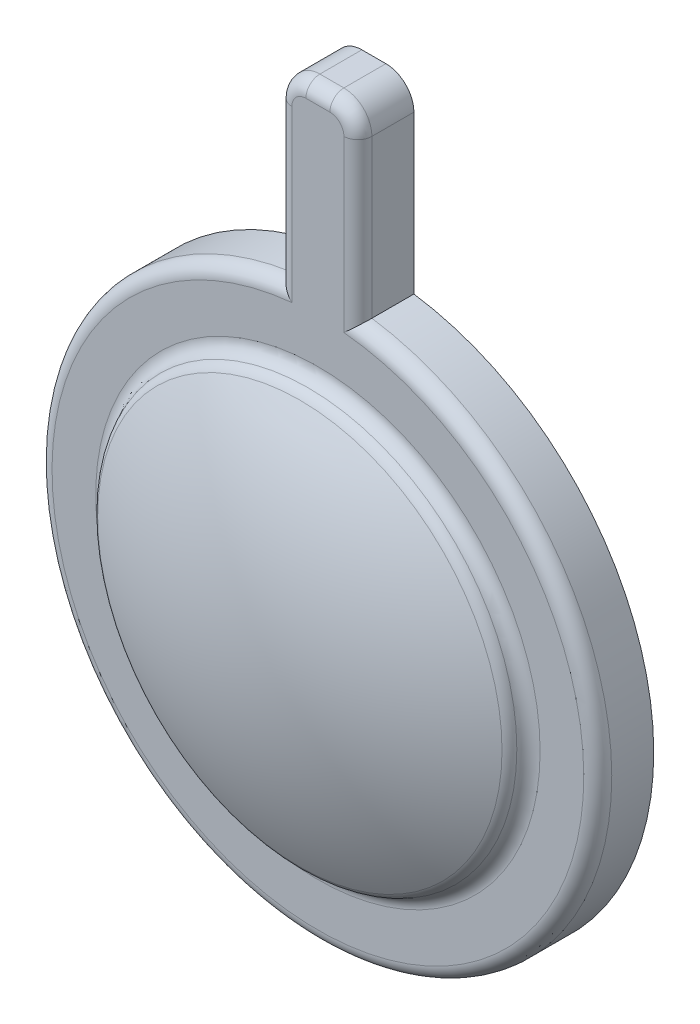
ISO-10303-21;
HEADER;
FILE_DESCRIPTION(('STEP AP214'),'2;1');
FILE_NAME('part.step','',(''),(''),'','','');
FILE_SCHEMA(('AUTOMOTIVE_DESIGN { 1 0 10303 214 1 1 1 1 }'));
ENDSEC;
DATA;
#1=APPLICATION_CONTEXT('core data for automotive mechanical design processes');
#2=APPLICATION_PROTOCOL_DEFINITION('international standard','automotive_design',2000,#1);
#3=PRODUCT_CONTEXT('',#1,'mechanical');
#4=PRODUCT('Part','Part','',(#3));
#5=PRODUCT_RELATED_PRODUCT_CATEGORY('part','',(#4));
#6=PRODUCT_DEFINITION_FORMATION('','',#4);
#7=PRODUCT_DEFINITION_CONTEXT('part definition',#1,'design');
#8=PRODUCT_DEFINITION('design','',#6,#7);
#9=PRODUCT_DEFINITION_SHAPE('','',#8);
#10=(LENGTH_UNIT() NAMED_UNIT(*) SI_UNIT(.MILLI.,.METRE.));
#11=(NAMED_UNIT(*) PLANE_ANGLE_UNIT() SI_UNIT($,.RADIAN.));
#12=(NAMED_UNIT(*) SI_UNIT($,.STERADIAN.) SOLID_ANGLE_UNIT());
#13=UNCERTAINTY_MEASURE_WITH_UNIT(LENGTH_MEASURE(1.E-05),#10,'distance_accuracy_value','');
#14=(GEOMETRIC_REPRESENTATION_CONTEXT(3) GLOBAL_UNCERTAINTY_ASSIGNED_CONTEXT((#13)) GLOBAL_UNIT_ASSIGNED_CONTEXT((#10,
#11,#12)) REPRESENTATION_CONTEXT('',''));
#15=CARTESIAN_POINT('',(0.,0.,0.));
#16=DIRECTION('',(0.,0.,1.));
#17=DIRECTION('',(1.,0.,0.));
#18=AXIS2_PLACEMENT_3D('',#15,#16,#17);
#19=CARTESIAN_POINT('',(0.,0.,4.));
#20=DIRECTION('',(0.,0.,-1.));
#21=DIRECTION('',(-1.,0.,0.));
#22=AXIS2_PLACEMENT_3D('',#19,#20,#21);
#23=CYLINDRICAL_SURFACE('',#22,20.);
#24=DIRECTION('',(0.,0.,-1.));
#25=VECTOR('',#24,1.);
#26=CARTESIAN_POINT('',(2.85828742721664,19.7947011339756,4.));
#27=LINE('',#26,#25);
#28=CARTESIAN_POINT('',(2.85828742721664,19.7947011339756,0.));
#29=VERTEX_POINT('',#28);
#30=CARTESIAN_POINT('',(2.85828742721664,19.7947011339756,3.));
#31=VERTEX_POINT('',#30);
#32=EDGE_CURVE('E136',#29,#31,#27,.F.);
#33=ORIENTED_EDGE('',*,*,#32,.T.);
#34=CARTESIAN_POINT('',(0.,0.,3.));
#35=DIRECTION('',(0.,0.,1.));
#36=DIRECTION('',(1.,0.,0.));
#37=AXIS2_PLACEMENT_3D('',#34,#35,#36);
#38=CIRCLE('',#37,20.);
#39=CARTESIAN_POINT('',(-2.85828742721664,19.7947011339756,3.));
#40=VERTEX_POINT('',#39);
#41=EDGE_CURVE('E42',#31,#40,#38,.F.);
#42=ORIENTED_EDGE('',*,*,#41,.T.);
#43=DIRECTION('',(0.,0.,-1.));
#44=VECTOR('',#43,1.);
#45=CARTESIAN_POINT('',(-2.85828742721664,19.7947011339756,4.));
#46=LINE('',#45,#44);
#47=CARTESIAN_POINT('',(-2.85828742721664,19.7947011339756,0.));
#48=VERTEX_POINT('',#47);
#49=EDGE_CURVE('E141',#40,#48,#46,.T.);
#50=ORIENTED_EDGE('',*,*,#49,.T.);
#51=CARTESIAN_POINT('',(0.,0.,0.));
#52=DIRECTION('',(0.,0.,1.));
#53=DIRECTION('',(1.,0.,0.));
#54=AXIS2_PLACEMENT_3D('',#51,#52,#53);
#55=CIRCLE('',#54,20.);
#56=EDGE_CURVE('E119',#48,#29,#55,.T.);
#57=ORIENTED_EDGE('',*,*,#56,.T.);
#58=EDGE_LOOP('',(#33,#42,#50,#57));
#59=FACE_BOUND('',#58,.T.);
#60=ADVANCED_FACE('F33',(#59),#23,.T.);
#61=CARTESIAN_POINT('',(0.,0.,4.));
#62=DIRECTION('',(0.,0.,1.));
#63=DIRECTION('',(1.,0.,0.));
#64=AXIS2_PLACEMENT_3D('',#61,#62,#63);
#65=PLANE('',#64);
#66=CARTESIAN_POINT('',(0.,0.,4.));
#67=DIRECTION('',(0.,0.,1.));
#68=DIRECTION('',(1.,0.,0.));
#69=AXIS2_PLACEMENT_3D('',#66,#67,#68);
#70=CIRCLE('',#69,19.);
#71=CARTESIAN_POINT('',(-1.85828742721664,18.9089071032106,4.));
#72=VERTEX_POINT('',#71);
#73=CARTESIAN_POINT('',(1.85828742721664,18.9089071032106,4.));
#74=VERTEX_POINT('',#73);
#75=EDGE_CURVE('E164',#72,#74,#70,.T.);
#76=ORIENTED_EDGE('',*,*,#75,.T.);
#77=DIRECTION('',(0.,-1.,0.));
#78=VECTOR('',#77,1.);
#79=CARTESIAN_POINT('',(1.85828742721664,0.,4.));
#80=LINE('',#79,#78);
#81=CARTESIAN_POINT('',(1.85828742721664,31.0503449964803,4.));
#82=VERTEX_POINT('',#81);
#83=EDGE_CURVE('E172',#74,#82,#80,.F.);
#84=ORIENTED_EDGE('',*,*,#83,.T.);
#85=CARTESIAN_POINT('',(0.85828742721664,31.0503449964803,4.));
#86=DIRECTION('',(0.,0.,1.));
#87=DIRECTION('',(1.,0.,0.));
#88=AXIS2_PLACEMENT_3D('',#85,#86,#87);
#89=CIRCLE('',#88,0.999999999999999);
#90=CARTESIAN_POINT('',(0.858287427216633,32.0503449964803,4.));
#91=VERTEX_POINT('',#90);
#92=EDGE_CURVE('E170',#82,#91,#89,.T.);
#93=ORIENTED_EDGE('',*,*,#92,.T.);
#94=DIRECTION('',(1.,0.,0.));
#95=VECTOR('',#94,1.);
#96=CARTESIAN_POINT('',(0.,32.0503449964803,4.));
#97=LINE('',#96,#95);
#98=CARTESIAN_POINT('',(-0.858287427216625,32.0503449964803,4.));
#99=VERTEX_POINT('',#98);
#100=EDGE_CURVE('E168',#91,#99,#97,.F.);
#101=ORIENTED_EDGE('',*,*,#100,.T.);
#102=CARTESIAN_POINT('',(-0.85828742721664,31.0503449964803,4.));
#103=DIRECTION('',(0.,0.,1.));
#104=DIRECTION('',(1.,0.,0.));
#105=AXIS2_PLACEMENT_3D('',#102,#103,#104);
#106=CIRCLE('',#105,0.999999999999999);
#107=CARTESIAN_POINT('',(-1.85828742721664,31.0503449964803,4.));
#108=VERTEX_POINT('',#107);
#109=EDGE_CURVE('E166',#99,#108,#106,.T.);
#110=ORIENTED_EDGE('',*,*,#109,.T.);
#111=DIRECTION('',(0.,1.,0.));
#112=VECTOR('',#111,1.);
#113=CARTESIAN_POINT('',(-1.85828742721664,0.,4.));
#114=LINE('',#113,#112);
#115=EDGE_CURVE('E162',#108,#72,#114,.F.);
#116=ORIENTED_EDGE('',*,*,#115,.T.);
#117=EDGE_LOOP('',(#76,#84,#93,#101,#110,#116));
#118=FACE_BOUND('',#117,.T.);
#119=CARTESIAN_POINT('',(0.,0.,4.));
#120=DIRECTION('',(0.,0.,1.));
#121=DIRECTION('',(1.,0.,0.));
#122=AXIS2_PLACEMENT_3D('',#119,#120,#121);
#123=CIRCLE('',#122,15.8800100936206);
#124=CARTESIAN_POINT('',(15.8800100936206,0.,4.));
#125=VERTEX_POINT('',#124);
#126=EDGE_CURVE('E156',#125,#125,#123,.F.);
#127=ORIENTED_EDGE('',*,*,#126,.T.);
#128=EDGE_LOOP('',(#127));
#129=FACE_BOUND('',#128,.T.);
#130=ADVANCED_FACE('F241',(#118,#129),#65,.T.);
#131=CARTESIAN_POINT('',(0.,0.,0.));
#132=DIRECTION('',(0.,0.,1.));
#133=DIRECTION('',(1.,0.,0.));
#134=AXIS2_PLACEMENT_3D('',#131,#132,#133);
#135=PLANE('',#134);
#136=CARTESIAN_POINT('',(0.,0.,0.));
#137=DIRECTION('',(0.,0.,1.));
#138=DIRECTION('',(1.,0.,0.));
#139=AXIS2_PLACEMENT_3D('',#136,#137,#138);
#140=CIRCLE('',#139,4.2);
#141=CARTESIAN_POINT('',(4.2,0.,0.));
#142=VERTEX_POINT('',#141);
#143=EDGE_CURVE('E147',#142,#142,#140,.F.);
#144=ORIENTED_EDGE('',*,*,#143,.F.);
#145=EDGE_LOOP('',(#144));
#146=FACE_BOUND('',#145,.T.);
#147=CARTESIAN_POINT('',(-7.00080184795615E-12,-15.5040048462578,0.));
#148=DIRECTION('',(0.,0.,1.));
#149=DIRECTION('',(1.,0.,0.));
#150=AXIS2_PLACEMENT_3D('',#147,#148,#149);
#151=CIRCLE('',#150,1.5);
#152=CARTESIAN_POINT('',(1.499999999993,-15.5040048462578,0.));
#153=VERTEX_POINT('',#152);
#154=EDGE_CURVE('E144',#153,#153,#151,.F.);
#155=ORIENTED_EDGE('',*,*,#154,.F.);
#156=EDGE_LOOP('',(#155));
#157=FACE_BOUND('',#156,.T.);
#158=CARTESIAN_POINT('',(-2.61075883134509E-12,28.4108423539282,0.));
#159=DIRECTION('',(0.,0.,-1.));
#160=DIRECTION('',(-1.,0.,0.));
#161=AXIS2_PLACEMENT_3D('',#158,#159,#160);
#162=CIRCLE('',#161,1.5);
#163=CARTESIAN_POINT('',(-1.50000000000261,28.4108423539282,0.));
#164=VERTEX_POINT('',#163);
#165=EDGE_CURVE('E231',#164,#164,#162,.T.);
#166=ORIENTED_EDGE('',*,*,#165,.F.);
#167=EDGE_LOOP('',(#166));
#168=FACE_BOUND('',#167,.T.);
#169=ORIENTED_EDGE('',*,*,#56,.F.);
#170=DIRECTION('',(0.,1.,0.));
#171=VECTOR('',#170,1.);
#172=CARTESIAN_POINT('',(-2.85828742721664,14.4082290696023,0.));
#173=LINE('',#172,#171);
#174=CARTESIAN_POINT('',(-2.85828742721664,31.0503449964803,0.));
#175=VERTEX_POINT('',#174);
#176=EDGE_CURVE('E105',#48,#175,#173,.T.);
#177=ORIENTED_EDGE('',*,*,#176,.T.);
#178=CARTESIAN_POINT('',(-0.85828742721664,31.0503449964803,0.));
#179=DIRECTION('',(0.,0.,-1.));
#180=DIRECTION('',(-1.,0.,0.));
#181=AXIS2_PLACEMENT_3D('',#178,#179,#180);
#182=CIRCLE('',#181,2.);
#183=CARTESIAN_POINT('',(-0.858287427216625,33.0503449964803,0.));
#184=VERTEX_POINT('',#183);
#185=EDGE_CURVE('E117',#175,#184,#182,.T.);
#186=ORIENTED_EDGE('',*,*,#185,.T.);
#187=DIRECTION('',(1.,0.,0.));
#188=VECTOR('',#187,1.);
#189=CARTESIAN_POINT('',(-0.858287427216625,33.0503449964803,0.));
#190=LINE('',#189,#188);
#191=CARTESIAN_POINT('',(0.858287427216625,33.0503449964803,0.));
#192=VERTEX_POINT('',#191);
#193=EDGE_CURVE('E125',#184,#192,#190,.T.);
#194=ORIENTED_EDGE('',*,*,#193,.T.);
#195=CARTESIAN_POINT('',(0.85828742721664,31.0503449964803,0.));
#196=DIRECTION('',(0.,0.,-1.));
#197=DIRECTION('',(-1.,0.,0.));
#198=AXIS2_PLACEMENT_3D('',#195,#196,#197);
#199=CIRCLE('',#198,2.);
#200=CARTESIAN_POINT('',(2.85828742721664,31.0503449964803,0.));
#201=VERTEX_POINT('',#200);
#202=EDGE_CURVE('E127',#192,#201,#199,.T.);
#203=ORIENTED_EDGE('',*,*,#202,.T.);
#204=DIRECTION('',(0.,-1.,0.));
#205=VECTOR('',#204,1.);
#206=CARTESIAN_POINT('',(2.85828742721664,14.4082290696023,0.));
#207=LINE('',#206,#205);
#208=EDGE_CURVE('E110',#201,#29,#207,.T.);
#209=ORIENTED_EDGE('',*,*,#208,.T.);
#210=EDGE_LOOP('',(#169,#177,#186,#194,#203,#209));
#211=FACE_BOUND('',#210,.T.);
#212=ADVANCED_FACE('F115',(#146,#157,#168,#211),#135,.F.);
#213=CARTESIAN_POINT('',(-2.85828742721664,14.4082290696023,4.));
#214=DIRECTION('',(-1.,0.,0.));
#215=DIRECTION('',(0.,0.,1.));
#216=AXIS2_PLACEMENT_3D('',#213,#214,#215);
#217=PLANE('',#216);
#218=ORIENTED_EDGE('',*,*,#49,.F.);
#219=DIRECTION('',(0.,1.,0.));
#220=VECTOR('',#219,1.);
#221=CARTESIAN_POINT('',(-2.85828742721664,14.4082290696023,3.));
#222=LINE('',#221,#220);
#223=CARTESIAN_POINT('',(-2.85828742721664,31.0503449964803,3.));
#224=VERTEX_POINT('',#223);
#225=EDGE_CURVE('E11',#40,#224,#222,.T.);
#226=ORIENTED_EDGE('',*,*,#225,.T.);
#227=DIRECTION('',(0.,0.,-1.));
#228=VECTOR('',#227,1.);
#229=CARTESIAN_POINT('',(-2.85828742721664,31.0503449964803,4.));
#230=LINE('',#229,#228);
#231=EDGE_CURVE('E102',#224,#175,#230,.T.);
#232=ORIENTED_EDGE('',*,*,#231,.T.);
#233=ORIENTED_EDGE('',*,*,#176,.F.);
#234=EDGE_LOOP('',(#218,#226,#232,#233));
#235=FACE_BOUND('',#234,.T.);
#236=ADVANCED_FACE('F104',(#235),#217,.T.);
#237=CARTESIAN_POINT('',(2.85828742721664,14.4082290696023,4.));
#238=DIRECTION('',(1.,0.,0.));
#239=DIRECTION('',(0.,0.,-1.));
#240=AXIS2_PLACEMENT_3D('',#237,#238,#239);
#241=PLANE('',#240);
#242=DIRECTION('',(0.,0.,-1.));
#243=VECTOR('',#242,1.);
#244=CARTESIAN_POINT('',(2.85828742721664,31.0503449964803,4.));
#245=LINE('',#244,#243);
#246=CARTESIAN_POINT('',(2.85828742721664,31.0503449964803,3.));
#247=VERTEX_POINT('',#246);
#248=EDGE_CURVE('E134',#247,#201,#245,.T.);
#249=ORIENTED_EDGE('',*,*,#248,.F.);
#250=DIRECTION('',(0.,-1.,0.));
#251=VECTOR('',#250,1.);
#252=CARTESIAN_POINT('',(2.85828742721664,14.4082290696023,3.));
#253=LINE('',#252,#251);
#254=EDGE_CURVE('E159',#247,#31,#253,.T.);
#255=ORIENTED_EDGE('',*,*,#254,.T.);
#256=ORIENTED_EDGE('',*,*,#32,.F.);
#257=ORIENTED_EDGE('',*,*,#208,.F.);
#258=EDGE_LOOP('',(#249,#255,#256,#257));
#259=FACE_BOUND('',#258,.T.);
#260=ADVANCED_FACE('F248',(#259),#241,.T.);
#261=CARTESIAN_POINT('',(0.85828742721664,31.0503449964803,4.));
#262=DIRECTION('',(0.,0.,-1.));
#263=DIRECTION('',(-1.,0.,0.));
#264=AXIS2_PLACEMENT_3D('',#261,#262,#263);
#265=CYLINDRICAL_SURFACE('',#264,2.);
#266=DIRECTION('',(0.,0.,-1.));
#267=VECTOR('',#266,1.);
#268=CARTESIAN_POINT('',(0.858287427216625,33.0503449964803,4.));
#269=LINE('',#268,#267);
#270=CARTESIAN_POINT('',(0.858287427216625,33.0503449964803,3.));
#271=VERTEX_POINT('',#270);
#272=EDGE_CURVE('E137',#271,#192,#269,.T.);
#273=ORIENTED_EDGE('',*,*,#272,.F.);
#274=CARTESIAN_POINT('',(0.85828742721664,31.0503449964803,3.));
#275=DIRECTION('',(0.,0.,1.));
#276=DIRECTION('',(1.,0.,0.));
#277=AXIS2_PLACEMENT_3D('',#274,#275,#276);
#278=CIRCLE('',#277,2.);
#279=EDGE_CURVE('E175',#271,#247,#278,.F.);
#280=ORIENTED_EDGE('',*,*,#279,.T.);
#281=ORIENTED_EDGE('',*,*,#248,.T.);
#282=ORIENTED_EDGE('',*,*,#202,.F.);
#283=EDGE_LOOP('',(#273,#280,#281,#282));
#284=FACE_BOUND('',#283,.T.);
#285=ADVANCED_FACE('F297',(#284),#265,.T.);
#286=CARTESIAN_POINT('',(-0.858287427216625,33.0503449964803,4.));
#287=DIRECTION('',(0.,1.,0.));
#288=DIRECTION('',(0.,0.,1.));
#289=AXIS2_PLACEMENT_3D('',#286,#287,#288);
#290=PLANE('',#289);
#291=DIRECTION('',(0.,0.,-1.));
#292=VECTOR('',#291,1.);
#293=CARTESIAN_POINT('',(-0.858287427216625,33.0503449964803,4.));
#294=LINE('',#293,#292);
#295=CARTESIAN_POINT('',(-0.858287427216625,33.0503449964803,3.));
#296=VERTEX_POINT('',#295);
#297=EDGE_CURVE('E109',#296,#184,#294,.T.);
#298=ORIENTED_EDGE('',*,*,#297,.F.);
#299=DIRECTION('',(1.,0.,0.));
#300=VECTOR('',#299,1.);
#301=CARTESIAN_POINT('',(-0.858287427216625,33.0503449964803,3.));
#302=LINE('',#301,#300);
#303=EDGE_CURVE('E177',#296,#271,#302,.T.);
#304=ORIENTED_EDGE('',*,*,#303,.T.);
#305=ORIENTED_EDGE('',*,*,#272,.T.);
#306=ORIENTED_EDGE('',*,*,#193,.F.);
#307=EDGE_LOOP('',(#298,#304,#305,#306));
#308=FACE_BOUND('',#307,.T.);
#309=ADVANCED_FACE('F303',(#308),#290,.T.);
#310=CARTESIAN_POINT('',(-0.85828742721664,31.0503449964803,4.));
#311=DIRECTION('',(0.,0.,-1.));
#312=DIRECTION('',(-1.,0.,0.));
#313=AXIS2_PLACEMENT_3D('',#310,#311,#312);
#314=CYLINDRICAL_SURFACE('',#313,2.);
#315=ORIENTED_EDGE('',*,*,#231,.F.);
#316=CARTESIAN_POINT('',(-0.85828742721664,31.0503449964803,3.));
#317=DIRECTION('',(0.,0.,1.));
#318=DIRECTION('',(1.,0.,0.));
#319=AXIS2_PLACEMENT_3D('',#316,#317,#318);
#320=CIRCLE('',#319,2.);
#321=EDGE_CURVE('E179',#224,#296,#320,.F.);
#322=ORIENTED_EDGE('',*,*,#321,.T.);
#323=ORIENTED_EDGE('',*,*,#297,.T.);
#324=ORIENTED_EDGE('',*,*,#185,.F.);
#325=EDGE_LOOP('',(#315,#322,#323,#324));
#326=FACE_BOUND('',#325,.T.);
#327=ADVANCED_FACE('F122',(#326),#314,.T.);
#328=CARTESIAN_POINT('',(-2.61075883134509E-12,28.4108423539282,2.1));
#329=DIRECTION('',(0.,0.,-1.));
#330=DIRECTION('',(-1.,0.,0.));
#331=AXIS2_PLACEMENT_3D('',#328,#329,#330);
#332=CYLINDRICAL_SURFACE('',#331,1.5);
#333=CARTESIAN_POINT('',(-2.61075883134509E-12,28.4108423539282,2.1));
#334=DIRECTION('',(0.,0.,-1.));
#335=DIRECTION('',(-1.,0.,0.));
#336=AXIS2_PLACEMENT_3D('',#333,#334,#335);
#337=CIRCLE('',#336,1.5);
#338=CARTESIAN_POINT('',(-1.50000000000261,28.4108423539282,2.1));
#339=VERTEX_POINT('',#338);
#340=EDGE_CURVE('E120',#339,#339,#337,.T.);
#341=ORIENTED_EDGE('',*,*,#340,.F.);
#342=EDGE_LOOP('',(#341));
#343=FACE_BOUND('',#342,.T.);
#344=ORIENTED_EDGE('',*,*,#165,.T.);
#345=EDGE_LOOP('',(#344));
#346=FACE_BOUND('',#345,.T.);
#347=ADVANCED_FACE('F238',(#343,#346),#332,.F.);
#348=CARTESIAN_POINT('',(-2.61075883134509E-12,28.4108423539282,2.1));
#349=DIRECTION('',(0.,0.,-1.));
#350=DIRECTION('',(-1.,0.,0.));
#351=AXIS2_PLACEMENT_3D('',#348,#349,#350);
#352=PLANE('',#351);
#353=ORIENTED_EDGE('',*,*,#340,.T.);
#354=EDGE_LOOP('',(#353));
#355=FACE_BOUND('',#354,.T.);
#356=ADVANCED_FACE('F332',(#355),#352,.T.);
#357=CARTESIAN_POINT('',(-7.00080184795615E-12,-15.5040048462578,-1.));
#358=DIRECTION('',(0.,0.,1.));
#359=DIRECTION('',(1.,0.,0.));
#360=AXIS2_PLACEMENT_3D('',#357,#358,#359);
#361=CYLINDRICAL_SURFACE('',#360,1.5);
#362=CARTESIAN_POINT('',(-7.00080184795615E-12,-15.5040048462578,-1.));
#363=DIRECTION('',(0.,0.,-1.));
#364=DIRECTION('',(-1.,0.,0.));
#365=AXIS2_PLACEMENT_3D('',#362,#363,#364);
#366=CIRCLE('',#365,1.5);
#367=CARTESIAN_POINT('',(-1.500000000007,-15.5040048462578,-1.));
#368=VERTEX_POINT('',#367);
#369=EDGE_CURVE('E226',#368,#368,#366,.T.);
#370=ORIENTED_EDGE('',*,*,#369,.F.);
#371=EDGE_LOOP('',(#370));
#372=FACE_BOUND('',#371,.T.);
#373=ORIENTED_EDGE('',*,*,#154,.T.);
#374=EDGE_LOOP('',(#373));
#375=FACE_BOUND('',#374,.T.);
#376=ADVANCED_FACE('F325',(#372,#375),#361,.T.);
#377=CARTESIAN_POINT('',(-7.00080184795615E-12,-15.5040048462578,-1.));
#378=DIRECTION('',(0.,0.,-1.));
#379=DIRECTION('',(-1.,0.,0.));
#380=AXIS2_PLACEMENT_3D('',#377,#378,#379);
#381=PLANE('',#380);
#382=ORIENTED_EDGE('',*,*,#369,.T.);
#383=EDGE_LOOP('',(#382));
#384=FACE_BOUND('',#383,.T.);
#385=ADVANCED_FACE('F320',(#384),#381,.T.);
#386=CARTESIAN_POINT('',(0.,0.,-18.7223939239338));
#387=DIRECTION('',(0.,0.,1.));
#388=DIRECTION('',(1.,0.,0.));
#389=AXIS2_PLACEMENT_3D('',#386,#387,#388);
#390=CYLINDRICAL_SURFACE('',#389,4.2);
#391=CARTESIAN_POINT('',(0.,0.,-6.84299999999984));
#392=DIRECTION('',(0.,0.,1.));
#393=DIRECTION('',(1.,0.,0.));
#394=AXIS2_PLACEMENT_3D('',#391,#392,#393);
#395=CIRCLE('',#394,4.2);
#396=CARTESIAN_POINT('',(4.2,0.,-6.84299999999991));
#397=VERTEX_POINT('',#396);
#398=EDGE_CURVE('E220',#397,#397,#395,.T.);
#399=ORIENTED_EDGE('',*,*,#398,.T.);
#400=EDGE_LOOP('',(#399));
#401=FACE_BOUND('',#400,.T.);
#402=ORIENTED_EDGE('',*,*,#143,.T.);
#403=EDGE_LOOP('',(#402));
#404=FACE_BOUND('',#403,.T.);
#405=ADVANCED_FACE('F315',(#401,#404),#390,.T.);
#406=CARTESIAN_POINT('',(-9.59999999999755,1.1790189731845E-13,-6.84299999999967));
#407=DIRECTION('',(0.,0.,1.));
#408=DIRECTION('',(0.,1.,0.));
#409=AXIS2_PLACEMENT_3D('',#406,#407,#408);
#410=PLANE('',#409);
#411=ORIENTED_EDGE('',*,*,#398,.F.);
#412=EDGE_LOOP('',(#411));
#413=FACE_BOUND('',#412,.T.);
#414=ADVANCED_FACE('F263',(#413),#410,.F.);
#415=CARTESIAN_POINT('',(0.,0.,-21.0029498723444));
#416=DIRECTION('',(0.,0.,1.));
#417=DIRECTION('',(1.,0.,0.));
#418=AXIS2_PLACEMENT_3D('',#415,#416,#417);
#419=SPHERICAL_SURFACE('',#418,30.0029498723444);
#420=CARTESIAN_POINT('',(0.,0.,5.29159868214314));
#421=DIRECTION('',(0.,0.,-1.));
#422=DIRECTION('',(-1.,0.,0.));
#423=AXIS2_PLACEMENT_3D('',#420,#421,#422);
#424=CIRCLE('',#423,14.4490040265102);
#425=CARTESIAN_POINT('',(-14.4490040265102,0.,5.29159868214314));
#426=VERTEX_POINT('',#425);
#427=EDGE_CURVE('E150',#426,#426,#424,.F.);
#428=ORIENTED_EDGE('',*,*,#427,.T.);
#429=EDGE_LOOP('',(#428));
#430=FACE_BOUND('',#429,.T.);
#431=ADVANCED_FACE('F259',(#430),#419,.T.);
#432=CARTESIAN_POINT('',(0.,0.,4.41519990581065));
#433=DIRECTION('',(0.,0.,-1.));
#434=DIRECTION('',(-1.,0.,0.));
#435=AXIS2_PLACEMENT_3D('',#432,#433,#434);
#436=TOROIDAL_SURFACE('',#435,13.9674179128785,1.);
#437=CARTESIAN_POINT('',(0.,0.,4.70759995290533));
#438=DIRECTION('',(0.,0.,-1.));
#439=DIRECTION('',(-1.,0.,0.));
#440=AXIS2_PLACEMENT_3D('',#437,#438,#439);
#441=CIRCLE('',#440,14.9237140032496);
#442=CARTESIAN_POINT('',(-14.9237140032496,0.,4.70759995290533));
#443=VERTEX_POINT('',#442);
#444=EDGE_CURVE('E153',#443,#443,#441,.F.);
#445=ORIENTED_EDGE('',*,*,#444,.T.);
#446=EDGE_LOOP('',(#445));
#447=FACE_BOUND('',#446,.T.);
#448=ORIENTED_EDGE('',*,*,#427,.F.);
#449=EDGE_LOOP('',(#448));
#450=FACE_BOUND('',#449,.T.);
#451=ADVANCED_FACE('F262',(#447,#450),#436,.T.);
#452=CARTESIAN_POINT('',(0.,0.,5.));
#453=DIRECTION('',(0.,0.,1.));
#454=DIRECTION('',(1.,0.,0.));
#455=AXIS2_PLACEMENT_3D('',#452,#453,#454);
#456=TOROIDAL_SURFACE('',#455,15.8800100936206,1.);
#457=ORIENTED_EDGE('',*,*,#126,.F.);
#458=EDGE_LOOP('',(#457));
#459=FACE_BOUND('',#458,.T.);
#460=ORIENTED_EDGE('',*,*,#444,.F.);
#461=EDGE_LOOP('',(#460));
#462=FACE_BOUND('',#461,.T.);
#463=ADVANCED_FACE('F266',(#459,#462),#456,.F.);
#464=CARTESIAN_POINT('',(-0.85828742721664,31.0503449964803,3.));
#465=DIRECTION('',(0.,0.,1.));
#466=DIRECTION('',(1.,0.,0.));
#467=AXIS2_PLACEMENT_3D('',#464,#465,#466);
#468=DEGENERATE_TOROIDAL_SURFACE('',#467,0.999999999999999,1.,.T.);
#469=CARTESIAN_POINT('',(-1.85828742721664,31.0503449964803,3.));
#470=DIRECTION('',(0.,-1.,0.));
#471=DIRECTION('',(1.,0.,0.));
#472=AXIS2_PLACEMENT_3D('',#469,#470,#471);
#473=CIRCLE('',#472,1.);
#474=EDGE_CURVE('E214',#108,#224,#473,.T.);
#475=ORIENTED_EDGE('',*,*,#474,.F.);
#476=ORIENTED_EDGE('',*,*,#109,.F.);
#477=CARTESIAN_POINT('',(-0.858287427216633,32.0503449964803,3.));
#478=DIRECTION('',(1.,0.,0.));
#479=DIRECTION('',(0.,0.,-1.));
#480=AXIS2_PLACEMENT_3D('',#477,#478,#479);
#481=CIRCLE('',#480,1.);
#482=EDGE_CURVE('E37',#296,#99,#481,.T.);
#483=ORIENTED_EDGE('',*,*,#482,.F.);
#484=ORIENTED_EDGE('',*,*,#321,.F.);
#485=EDGE_LOOP('',(#475,#476,#483,#484));
#486=FACE_BOUND('',#485,.T.);
#487=ADVANCED_FACE('F35',(#486),#468,.T.);
#488=CARTESIAN_POINT('',(-0.858287427216625,32.0503449964803,3.));
#489=DIRECTION('',(1.,0.,0.));
#490=DIRECTION('',(0.,0.,-1.));
#491=AXIS2_PLACEMENT_3D('',#488,#489,#490);
#492=CYLINDRICAL_SURFACE('',#491,1.);
#493=ORIENTED_EDGE('',*,*,#482,.T.);
#494=ORIENTED_EDGE('',*,*,#100,.F.);
#495=CARTESIAN_POINT('',(0.858287427216625,32.0503449964803,3.));
#496=DIRECTION('',(1.,0.,0.));
#497=DIRECTION('',(0.,0.,-1.));
#498=AXIS2_PLACEMENT_3D('',#495,#496,#497);
#499=CIRCLE('',#498,1.);
#500=EDGE_CURVE('E212',#271,#91,#499,.T.);
#501=ORIENTED_EDGE('',*,*,#500,.F.);
#502=ORIENTED_EDGE('',*,*,#303,.F.);
#503=EDGE_LOOP('',(#493,#494,#501,#502));
#504=FACE_BOUND('',#503,.T.);
#505=ADVANCED_FACE('F273',(#504),#492,.T.);
#506=CARTESIAN_POINT('',(-1.85828742721664,14.4082290696023,3.));
#507=DIRECTION('',(0.,1.,0.));
#508=DIRECTION('',(0.,0.,1.));
#509=AXIS2_PLACEMENT_3D('',#506,#507,#508);
#510=CYLINDRICAL_SURFACE('',#509,1.);
#511=ORIENTED_EDGE('',*,*,#474,.T.);
#512=ORIENTED_EDGE('',*,*,#225,.F.);
#513=CARTESIAN_POINT('',(-2.85828742721664,19.7947011339756,3.));
#514=CARTESIAN_POINT('',(-2.85829001901455,19.794703253677,3.02329134749768));
#515=CARTESIAN_POINT('',(-2.85747300842312,19.7939958789772,3.04656922537933));
#516=CARTESIAN_POINT('',(-2.85423199317264,19.7911889944715,3.09291445400949));
#517=CARTESIAN_POINT('',(-2.85180896555006,19.7890903310698,3.11598192411746));
#518=CARTESIAN_POINT('',(-2.84222875612437,19.7807906475039,3.18427158142798));
#519=CARTESIAN_POINT('',(-2.83275927988693,19.7725849535342,3.22895728198107));
#520=CARTESIAN_POINT('',(-2.80830167827388,19.7513700854421,3.31542605760945));
#521=CARTESIAN_POINT('',(-2.79332478730388,19.7383706896932,3.35721483720875));
#522=CARTESIAN_POINT('',(-2.75867807622174,19.7082589371912,3.43726866794122));
#523=CARTESIAN_POINT('',(-2.73899971129185,19.6911390911934,3.47552712522431));
#524=CARTESIAN_POINT('',(-2.68852100908352,19.6471536859966,3.56026595966893));
#525=CARTESIAN_POINT('',(-2.65620997420851,19.6189502455515,3.60515136361193));
#526=CARTESIAN_POINT('',(-2.58660793979806,19.5580423744315,3.68735865805856));
#527=CARTESIAN_POINT('',(-2.54930865280147,19.5253304505552,3.72466769567214));
#528=CARTESIAN_POINT('',(-2.45902066606385,19.4459245534919,3.80229920865359));
#529=CARTESIAN_POINT('',(-2.40476566449802,19.3980507384309,3.83993559271421));
#530=CARTESIAN_POINT('',(-2.2926428300902,19.2987158546334,3.90304042049664));
#531=CARTESIAN_POINT('',(-2.23477158257107,19.2472513898796,3.92849716100637));
#532=CARTESIAN_POINT('',(-2.12462725444665,19.1488881304094,3.96539819195962));
#533=CARTESIAN_POINT('',(-2.0725764613711,19.1022394251706,3.97821134688042));
#534=CARTESIAN_POINT('',(-1.96796756420188,19.0081347140259,3.99537523499653));
#535=CARTESIAN_POINT('',(-1.9154106773247,18.9606805015238,3.99974277581142));
#536=CARTESIAN_POINT('',(-1.86141880288261,18.9117456669398,3.99999632119393));
#537=CARTESIAN_POINT('',(-1.85985305086788,18.9103264073099,3.99999999781427));
#538=CARTESIAN_POINT('',(-1.85828742721664,18.9089071032106,4.));
#539=B_SPLINE_CURVE_WITH_KNOTS('',3,(#513,#514,#515,#516,#517,#518,#519,#520,#521,#522,#523,
#524,#525,#526,#527,#528,#529,#530,#531,#532,#533,#534,#535,#536,#537,#538),.UNSPECIFIED.,.F.,
.F.,(4,2,2,2,2,2,2,2,2,2,2,2,4),(0.,0.0698232517961061,0.139604064861303,0.278053737043674,
0.416222542622132,0.554644403068949,0.739877818151795,0.925422893661414,1.16880740778393,
1.41242531858474,1.62510778700759,1.83736655860471,1.84370633937573),.UNSPECIFIED.);
#540=EDGE_CURVE('E205',#72,#40,#539,.F.);
#541=ORIENTED_EDGE('',*,*,#540,.F.);
#542=ORIENTED_EDGE('',*,*,#115,.F.);
#543=EDGE_LOOP('',(#511,#512,#541,#542));
#544=FACE_BOUND('',#543,.T.);
#545=ADVANCED_FACE('F201',(#544),#510,.T.);
#546=CARTESIAN_POINT('',(0.85828742721664,31.0503449964803,3.));
#547=DIRECTION('',(0.,0.,1.));
#548=DIRECTION('',(1.,0.,0.));
#549=AXIS2_PLACEMENT_3D('',#546,#547,#548);
#550=DEGENERATE_TOROIDAL_SURFACE('',#549,0.999999999999999,1.,.T.);
#551=ORIENTED_EDGE('',*,*,#500,.T.);
#552=ORIENTED_EDGE('',*,*,#92,.F.);
#553=CARTESIAN_POINT('',(1.85828742721664,31.0503449964803,3.));
#554=DIRECTION('',(0.,-1.,0.));
#555=DIRECTION('',(0.,0.,-1.));
#556=AXIS2_PLACEMENT_3D('',#553,#554,#555);
#557=CIRCLE('',#556,1.);
#558=EDGE_CURVE('E190',#247,#82,#557,.T.);
#559=ORIENTED_EDGE('',*,*,#558,.F.);
#560=ORIENTED_EDGE('',*,*,#279,.F.);
#561=EDGE_LOOP('',(#551,#552,#559,#560));
#562=FACE_BOUND('',#561,.T.);
#563=ADVANCED_FACE('F199',(#562),#550,.T.);
#564=CARTESIAN_POINT('',(0.,0.,3.));
#565=DIRECTION('',(0.,0.,1.));
#566=DIRECTION('',(1.,0.,0.));
#567=AXIS2_PLACEMENT_3D('',#564,#565,#566);
#568=TOROIDAL_SURFACE('',#567,19.,1.);
#569=ORIENTED_EDGE('',*,*,#540,.T.);
#570=ORIENTED_EDGE('',*,*,#41,.F.);
#571=CARTESIAN_POINT('',(2.85828742721664,19.7947011339756,3.));
#572=CARTESIAN_POINT('',(2.85829001901455,19.794703253677,3.02329134749768));
#573=CARTESIAN_POINT('',(2.85747300842312,19.7939958789772,3.04656922537933));
#574=CARTESIAN_POINT('',(2.85423199317264,19.7911889944715,3.09291445400949));
#575=CARTESIAN_POINT('',(2.85180896555006,19.7890903310698,3.11598192411746));
#576=CARTESIAN_POINT('',(2.84222875612437,19.7807906475039,3.18427158142798));
#577=CARTESIAN_POINT('',(2.83275927988693,19.7725849535342,3.22895728198107));
#578=CARTESIAN_POINT('',(2.80830167827388,19.7513700854421,3.31542605760945));
#579=CARTESIAN_POINT('',(2.79332478730388,19.7383706896932,3.35721483720875));
#580=CARTESIAN_POINT('',(2.75867807622174,19.7082589371912,3.43726866794122));
#581=CARTESIAN_POINT('',(2.73899971129185,19.6911390911934,3.47552712522431));
#582=CARTESIAN_POINT('',(2.68852100908352,19.6471536859966,3.56026595966893));
#583=CARTESIAN_POINT('',(2.65620997420851,19.6189502455515,3.60515136361193));
#584=CARTESIAN_POINT('',(2.58660793979806,19.5580423744315,3.68735865805856));
#585=CARTESIAN_POINT('',(2.54930865280147,19.5253304505552,3.72466769567214));
#586=CARTESIAN_POINT('',(2.45902066606385,19.4459245534919,3.80229920865359));
#587=CARTESIAN_POINT('',(2.40476566449802,19.3980507384309,3.83993559271421));
#588=CARTESIAN_POINT('',(2.2926428300902,19.2987158546334,3.90304042049664));
#589=CARTESIAN_POINT('',(2.23477158257107,19.2472513898796,3.92849716100637));
#590=CARTESIAN_POINT('',(2.12462725444665,19.1488881304094,3.96539819195962));
#591=CARTESIAN_POINT('',(2.0725764613711,19.1022394251706,3.97821134688042));
#592=CARTESIAN_POINT('',(1.96796756420188,19.0081347140259,3.99537523499653));
#593=CARTESIAN_POINT('',(1.9154106773247,18.9606805015238,3.99974277581142));
#594=CARTESIAN_POINT('',(1.86141880288261,18.9117456669398,3.99999632119393));
#595=CARTESIAN_POINT('',(1.85985305086788,18.9103264073099,3.99999999781427));
#596=CARTESIAN_POINT('',(1.85828742721664,18.9089071032106,4.));
#597=B_SPLINE_CURVE_WITH_KNOTS('',3,(#571,#572,#573,#574,#575,#576,#577,#578,#579,#580,#581,
#582,#583,#584,#585,#586,#587,#588,#589,#590,#591,#592,#593,#594,#595,#596),.UNSPECIFIED.,.F.,
.F.,(4,2,2,2,2,2,2,2,2,2,2,2,4),(0.,0.0698232517961061,0.139604064861303,0.278053737043674,
0.416222542622132,0.554644403068949,0.739877818151795,0.925422893661414,1.16880740778393,
1.41242531858474,1.62510778700759,1.83736655860471,1.84370633937573),.UNSPECIFIED.);
#598=EDGE_CURVE('E182',#74,#31,#597,.F.);
#599=ORIENTED_EDGE('',*,*,#598,.F.);
#600=ORIENTED_EDGE('',*,*,#75,.F.);
#601=EDGE_LOOP('',(#569,#570,#599,#600));
#602=FACE_BOUND('',#601,.T.);
#603=ADVANCED_FACE('F195',(#602),#568,.T.);
#604=CARTESIAN_POINT('',(1.85828742721664,14.4082290696023,3.));
#605=DIRECTION('',(0.,-1.,0.));
#606=DIRECTION('',(0.,0.,-1.));
#607=AXIS2_PLACEMENT_3D('',#604,#605,#606);
#608=CYLINDRICAL_SURFACE('',#607,1.);
#609=ORIENTED_EDGE('',*,*,#558,.T.);
#610=ORIENTED_EDGE('',*,*,#83,.F.);
#611=ORIENTED_EDGE('',*,*,#598,.T.);
#612=ORIENTED_EDGE('',*,*,#254,.F.);
#613=EDGE_LOOP('',(#609,#610,#611,#612));
#614=FACE_BOUND('',#613,.T.);
#615=ADVANCED_FACE('F192',(#614),#608,.T.);
#616=CLOSED_SHELL('',(#60,#130,#212,#236,#260,#285,#309,#327,#347,#356,#376,#385,#405,#414,#431,
#451,#463,#487,#505,#545,#563,#603,#615));
#617=MANIFOLD_SOLID_BREP('B2',#616);
#618=ADVANCED_BREP_SHAPE_REPRESENTATION('',(#18,#617),#14);
#619=SHAPE_DEFINITION_REPRESENTATION(#9,#618);
ENDSEC;
END-ISO-10303-21;
